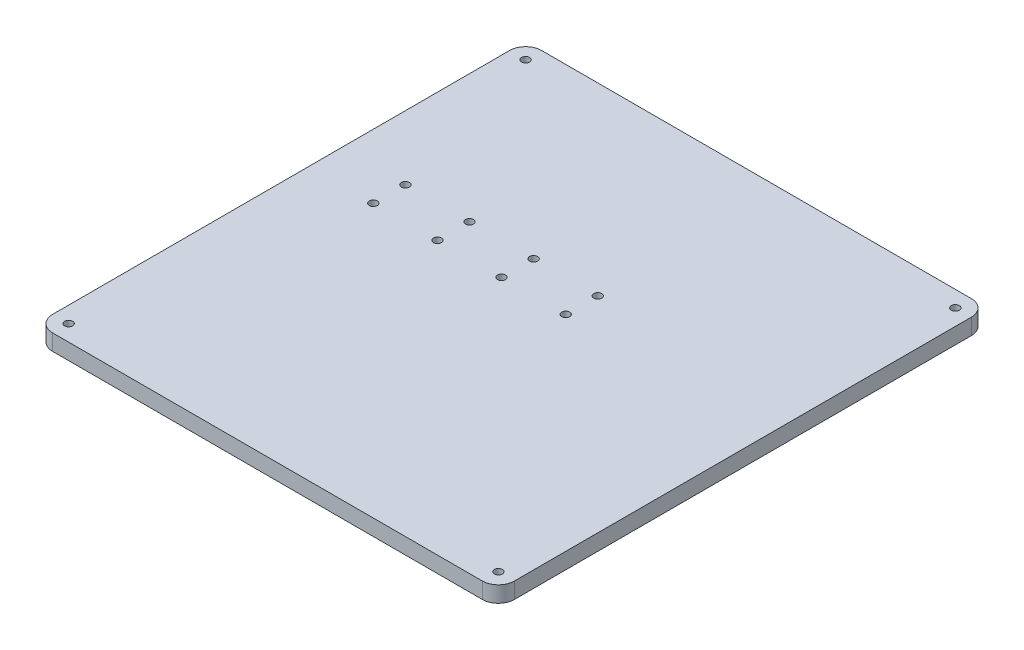
ISO-10303-21;
HEADER;
FILE_DESCRIPTION(('STEP AP214'),'2;1');
FILE_NAME('part.step','',(''),(''),'','','');
FILE_SCHEMA(('AUTOMOTIVE_DESIGN { 1 0 10303 214 1 1 1 1 }'));
ENDSEC;
DATA;
#1=APPLICATION_CONTEXT('core data for automotive mechanical design processes');
#2=APPLICATION_PROTOCOL_DEFINITION('international standard','automotive_design',2000,#1);
#3=PRODUCT_CONTEXT('',#1,'mechanical');
#4=PRODUCT('Part','Part','',(#3));
#5=PRODUCT_RELATED_PRODUCT_CATEGORY('part','',(#4));
#6=PRODUCT_DEFINITION_FORMATION('','',#4);
#7=PRODUCT_DEFINITION_CONTEXT('part definition',#1,'design');
#8=PRODUCT_DEFINITION('design','',#6,#7);
#9=PRODUCT_DEFINITION_SHAPE('','',#8);
#10=(LENGTH_UNIT() NAMED_UNIT(*) SI_UNIT(.MILLI.,.METRE.));
#11=(NAMED_UNIT(*) PLANE_ANGLE_UNIT() SI_UNIT($,.RADIAN.));
#12=(NAMED_UNIT(*) SI_UNIT($,.STERADIAN.) SOLID_ANGLE_UNIT());
#13=UNCERTAINTY_MEASURE_WITH_UNIT(LENGTH_MEASURE(1.E-05),#10,'distance_accuracy_value','');
#14=(GEOMETRIC_REPRESENTATION_CONTEXT(3) GLOBAL_UNCERTAINTY_ASSIGNED_CONTEXT((#13)) GLOBAL_UNIT_ASSIGNED_CONTEXT((#10,
#11,#12)) REPRESENTATION_CONTEXT('',''));
#15=CARTESIAN_POINT('',(0.,0.,0.));
#16=DIRECTION('',(0.,0.,1.));
#17=DIRECTION('',(1.,0.,0.));
#18=AXIS2_PLACEMENT_3D('',#15,#16,#17);
#19=CARTESIAN_POINT('',(0.,10.,0.));
#20=DIRECTION('',(0.,1.,0.));
#21=DIRECTION('',(0.,0.,1.));
#22=AXIS2_PLACEMENT_3D('',#19,#20,#21);
#23=PLANE('',#22);
#24=CARTESIAN_POINT('',(179.382488479263,10.,233.733870967742));
#25=DIRECTION('',(0.,1.,0.));
#26=DIRECTION('',(0.,0.,1.));
#27=AXIS2_PLACEMENT_3D('',#24,#25,#26);
#28=CIRCLE('',#27,2.50000000000002);
#29=CARTESIAN_POINT('',(179.382488479263,10.,236.233870967742));
#30=VERTEX_POINT('',#29);
#31=EDGE_CURVE('E229',#30,#30,#28,.T.);
#32=ORIENTED_EDGE('',*,*,#31,.F.);
#33=EDGE_LOOP('',(#32));
#34=FACE_BOUND('',#33,.T.);
#35=CARTESIAN_POINT('',(-58.6175115207371,10.,73.7338709677419));
#36=DIRECTION('',(0.,1.,0.));
#37=DIRECTION('',(0.,0.,1.));
#38=AXIS2_PLACEMENT_3D('',#35,#36,#37);
#39=CIRCLE('',#38,2.5);
#40=CARTESIAN_POINT('',(-58.6175115207371,10.,76.2338709677419));
#41=VERTEX_POINT('',#40);
#42=EDGE_CURVE('E217',#41,#41,#39,.T.);
#43=ORIENTED_EDGE('',*,*,#42,.F.);
#44=EDGE_LOOP('',(#43));
#45=FACE_BOUND('',#44,.T.);
#46=CARTESIAN_POINT('',(21.3824884792629,10.,73.7338709677419));
#47=DIRECTION('',(0.,1.,0.));
#48=DIRECTION('',(0.,0.,1.));
#49=AXIS2_PLACEMENT_3D('',#46,#47,#48);
#50=CIRCLE('',#49,2.5);
#51=CARTESIAN_POINT('',(21.3824884792629,10.,76.2338709677419));
#52=VERTEX_POINT('',#51);
#53=EDGE_CURVE('E205',#52,#52,#50,.T.);
#54=ORIENTED_EDGE('',*,*,#53,.F.);
#55=EDGE_LOOP('',(#54));
#56=FACE_BOUND('',#55,.T.);
#57=CARTESIAN_POINT('',(61.3824884792627,10.,53.7338709677419));
#58=DIRECTION('',(0.,1.,0.));
#59=DIRECTION('',(0.,0.,1.));
#60=AXIS2_PLACEMENT_3D('',#57,#58,#59);
#61=CIRCLE('',#60,2.49999999999999);
#62=CARTESIAN_POINT('',(61.3824884792627,10.,56.2338709677419));
#63=VERTEX_POINT('',#62);
#64=EDGE_CURVE('E193',#63,#63,#61,.T.);
#65=ORIENTED_EDGE('',*,*,#64,.F.);
#66=EDGE_LOOP('',(#65));
#67=FACE_BOUND('',#66,.T.);
#68=CARTESIAN_POINT('',(-18.6175115207373,10.,53.7338709677419));
#69=DIRECTION('',(0.,1.,0.));
#70=DIRECTION('',(0.,0.,1.));
#71=AXIS2_PLACEMENT_3D('',#68,#69,#70);
#72=CIRCLE('',#71,2.5);
#73=CARTESIAN_POINT('',(-18.6175115207373,10.,56.2338709677419));
#74=VERTEX_POINT('',#73);
#75=EDGE_CURVE('E181',#74,#74,#72,.T.);
#76=ORIENTED_EDGE('',*,*,#75,.F.);
#77=EDGE_LOOP('',(#76));
#78=FACE_BOUND('',#77,.T.);
#79=CARTESIAN_POINT('',(-58.6175115207373,10.,53.7338709677419));
#80=DIRECTION('',(0.,1.,0.));
#81=DIRECTION('',(0.,0.,1.));
#82=AXIS2_PLACEMENT_3D('',#79,#80,#81);
#83=CIRCLE('',#82,2.5);
#84=CARTESIAN_POINT('',(-58.6175115207373,10.,56.2338709677419));
#85=VERTEX_POINT('',#84);
#86=EDGE_CURVE('E164',#85,#85,#83,.T.);
#87=ORIENTED_EDGE('',*,*,#86,.F.);
#88=EDGE_LOOP('',(#87));
#89=FACE_BOUND('',#88,.T.);
#90=DIRECTION('',(0.,0.,-1.));
#91=VECTOR('',#90,1.);
#92=CARTESIAN_POINT('',(189.382488479263,10.,-61.2661290322581));
#93=LINE('',#92,#91);
#94=CARTESIAN_POINT('',(189.382488479263,10.,233.733870967742));
#95=VERTEX_POINT('',#94);
#96=CARTESIAN_POINT('',(189.382488479263,10.,-51.2661290322581));
#97=VERTEX_POINT('',#96);
#98=EDGE_CURVE('E171',#95,#97,#93,.T.);
#99=ORIENTED_EDGE('',*,*,#98,.T.);
#100=CARTESIAN_POINT('',(179.382488479263,10.,-51.2661290322581));
#101=DIRECTION('',(0.,1.,0.));
#102=DIRECTION('',(0.,0.,1.));
#103=AXIS2_PLACEMENT_3D('',#100,#101,#102);
#104=CIRCLE('',#103,10.);
#105=CARTESIAN_POINT('',(179.382488479263,10.,-61.2661290322581));
#106=VERTEX_POINT('',#105);
#107=EDGE_CURVE('E148',#97,#106,#104,.T.);
#108=ORIENTED_EDGE('',*,*,#107,.T.);
#109=DIRECTION('',(-1.,0.,0.));
#110=VECTOR('',#109,1.);
#111=CARTESIAN_POINT('',(-98.6175115207373,10.,-61.2661290322581));
#112=LINE('',#111,#110);
#113=CARTESIAN_POINT('',(-88.6175115207373,10.,-61.2661290322581));
#114=VERTEX_POINT('',#113);
#115=EDGE_CURVE('E119',#106,#114,#112,.T.);
#116=ORIENTED_EDGE('',*,*,#115,.T.);
#117=CARTESIAN_POINT('',(-88.6175115207373,10.,-51.2661290322581));
#118=DIRECTION('',(0.,1.,0.));
#119=DIRECTION('',(0.,0.,1.));
#120=AXIS2_PLACEMENT_3D('',#117,#118,#119);
#121=CIRCLE('',#120,10.);
#122=CARTESIAN_POINT('',(-98.6175115207373,10.,-51.2661290322581));
#123=VERTEX_POINT('',#122);
#124=EDGE_CURVE('E143',#114,#123,#121,.T.);
#125=ORIENTED_EDGE('',*,*,#124,.T.);
#126=DIRECTION('',(0.,0.,1.));
#127=VECTOR('',#126,1.);
#128=CARTESIAN_POINT('',(-98.6175115207373,10.,-61.2661290322581));
#129=LINE('',#128,#127);
#130=CARTESIAN_POINT('',(-98.6175115207373,10.,233.733870967742));
#131=VERTEX_POINT('',#130);
#132=EDGE_CURVE('E126',#123,#131,#129,.T.);
#133=ORIENTED_EDGE('',*,*,#132,.T.);
#134=CARTESIAN_POINT('',(-88.6175115207373,10.,233.733870967742));
#135=DIRECTION('',(0.,1.,0.));
#136=DIRECTION('',(0.,0.,1.));
#137=AXIS2_PLACEMENT_3D('',#134,#135,#136);
#138=CIRCLE('',#137,10.);
#139=CARTESIAN_POINT('',(-88.6175115207373,10.,243.733870967742));
#140=VERTEX_POINT('',#139);
#141=EDGE_CURVE('E55',#131,#140,#138,.T.);
#142=ORIENTED_EDGE('',*,*,#141,.T.);
#143=DIRECTION('',(1.,0.,0.));
#144=VECTOR('',#143,1.);
#145=CARTESIAN_POINT('',(-98.6175115207373,10.,243.733870967742));
#146=LINE('',#145,#144);
#147=CARTESIAN_POINT('',(179.382488479263,10.,243.733870967742));
#148=VERTEX_POINT('',#147);
#149=EDGE_CURVE('E129',#140,#148,#146,.T.);
#150=ORIENTED_EDGE('',*,*,#149,.T.);
#151=CARTESIAN_POINT('',(179.382488479263,10.,233.733870967742));
#152=DIRECTION('',(0.,1.,0.));
#153=DIRECTION('',(0.,0.,1.));
#154=AXIS2_PLACEMENT_3D('',#151,#152,#153);
#155=CIRCLE('',#154,10.);
#156=EDGE_CURVE('E146',#148,#95,#155,.T.);
#157=ORIENTED_EDGE('',*,*,#156,.T.);
#158=EDGE_LOOP('',(#99,#108,#116,#125,#133,#142,#150,#157));
#159=FACE_BOUND('',#158,.T.);
#160=CARTESIAN_POINT('',(-88.6175115207373,10.,-51.2661290322581));
#161=DIRECTION('',(0.,1.,0.));
#162=DIRECTION('',(0.,0.,1.));
#163=AXIS2_PLACEMENT_3D('',#160,#161,#162);
#164=CIRCLE('',#163,2.50000000000001);
#165=CARTESIAN_POINT('',(-88.6175115207373,10.,-48.7661290322581));
#166=VERTEX_POINT('',#165);
#167=EDGE_CURVE('E176',#166,#166,#164,.T.);
#168=ORIENTED_EDGE('',*,*,#167,.F.);
#169=EDGE_LOOP('',(#168));
#170=FACE_BOUND('',#169,.T.);
#171=CARTESIAN_POINT('',(21.3824884792627,10.,53.7338709677419));
#172=DIRECTION('',(0.,1.,0.));
#173=DIRECTION('',(0.,0.,1.));
#174=AXIS2_PLACEMENT_3D('',#171,#172,#173);
#175=CIRCLE('',#174,2.5);
#176=CARTESIAN_POINT('',(21.3824884792627,10.,56.2338709677419));
#177=VERTEX_POINT('',#176);
#178=EDGE_CURVE('E187',#177,#177,#175,.T.);
#179=ORIENTED_EDGE('',*,*,#178,.F.);
#180=EDGE_LOOP('',(#179));
#181=FACE_BOUND('',#180,.T.);
#182=CARTESIAN_POINT('',(-18.6175115207371,10.,73.7338709677419));
#183=DIRECTION('',(0.,1.,0.));
#184=DIRECTION('',(0.,0.,1.));
#185=AXIS2_PLACEMENT_3D('',#182,#183,#184);
#186=CIRCLE('',#185,2.5);
#187=CARTESIAN_POINT('',(-18.6175115207371,10.,76.2338709677419));
#188=VERTEX_POINT('',#187);
#189=EDGE_CURVE('E199',#188,#188,#186,.T.);
#190=ORIENTED_EDGE('',*,*,#189,.F.);
#191=EDGE_LOOP('',(#190));
#192=FACE_BOUND('',#191,.T.);
#193=CARTESIAN_POINT('',(61.3824884792629,10.,73.7338709677419));
#194=DIRECTION('',(0.,1.,0.));
#195=DIRECTION('',(0.,0.,1.));
#196=AXIS2_PLACEMENT_3D('',#193,#194,#195);
#197=CIRCLE('',#196,2.5);
#198=CARTESIAN_POINT('',(61.3824884792629,10.,76.2338709677419));
#199=VERTEX_POINT('',#198);
#200=EDGE_CURVE('E211',#199,#199,#197,.T.);
#201=ORIENTED_EDGE('',*,*,#200,.F.);
#202=EDGE_LOOP('',(#201));
#203=FACE_BOUND('',#202,.T.);
#204=CARTESIAN_POINT('',(179.382488479263,10.,-51.2661290322581));
#205=DIRECTION('',(0.,1.,0.));
#206=DIRECTION('',(0.,0.,-1.));
#207=AXIS2_PLACEMENT_3D('',#204,#205,#206);
#208=CIRCLE('',#207,2.50000000000002);
#209=CARTESIAN_POINT('',(179.382488479263,10.,-53.7661290322581));
#210=VERTEX_POINT('',#209);
#211=EDGE_CURVE('E223',#210,#210,#208,.T.);
#212=ORIENTED_EDGE('',*,*,#211,.F.);
#213=EDGE_LOOP('',(#212));
#214=FACE_BOUND('',#213,.T.);
#215=CARTESIAN_POINT('',(-88.6175115207373,10.,233.733870967742));
#216=DIRECTION('',(0.,1.,0.));
#217=DIRECTION('',(0.,0.,-1.));
#218=AXIS2_PLACEMENT_3D('',#215,#216,#217);
#219=CIRCLE('',#218,2.50000000000001);
#220=CARTESIAN_POINT('',(-88.6175115207373,10.,231.233870967742));
#221=VERTEX_POINT('',#220);
#222=EDGE_CURVE('E235',#221,#221,#219,.T.);
#223=ORIENTED_EDGE('',*,*,#222,.F.);
#224=EDGE_LOOP('',(#223));
#225=FACE_BOUND('',#224,.T.);
#226=ADVANCED_FACE('F33',(#34,#45,#56,#67,#78,#89,#159,#170,#181,#192,#203,#214,#225),#23,.T.);
#227=CARTESIAN_POINT('',(0.,0.,0.));
#228=DIRECTION('',(0.,1.,0.));
#229=DIRECTION('',(0.,0.,1.));
#230=AXIS2_PLACEMENT_3D('',#227,#228,#229);
#231=PLANE('',#230);
#232=DIRECTION('',(-1.,0.,0.));
#233=VECTOR('',#232,1.);
#234=CARTESIAN_POINT('',(-98.6175115207373,0.,-61.2661290322581));
#235=LINE('',#234,#233);
#236=CARTESIAN_POINT('',(179.382488479263,0.,-61.2661290322581));
#237=VERTEX_POINT('',#236);
#238=CARTESIAN_POINT('',(-88.6175115207373,0.,-61.2661290322581));
#239=VERTEX_POINT('',#238);
#240=EDGE_CURVE('E116',#237,#239,#235,.T.);
#241=ORIENTED_EDGE('',*,*,#240,.F.);
#242=CARTESIAN_POINT('',(179.382488479263,0.,-51.2661290322581));
#243=DIRECTION('',(0.,1.,0.));
#244=DIRECTION('',(0.,0.,1.));
#245=AXIS2_PLACEMENT_3D('',#242,#243,#244);
#246=CIRCLE('',#245,10.);
#247=CARTESIAN_POINT('',(189.382488479263,0.,-51.2661290322581));
#248=VERTEX_POINT('',#247);
#249=EDGE_CURVE('E99',#237,#248,#246,.F.);
#250=ORIENTED_EDGE('',*,*,#249,.T.);
#251=DIRECTION('',(0.,0.,-1.));
#252=VECTOR('',#251,1.);
#253=CARTESIAN_POINT('',(189.382488479263,0.,-61.2661290322581));
#254=LINE('',#253,#252);
#255=CARTESIAN_POINT('',(189.382488479263,0.,233.733870967742));
#256=VERTEX_POINT('',#255);
#257=EDGE_CURVE('E127',#256,#248,#254,.T.);
#258=ORIENTED_EDGE('',*,*,#257,.F.);
#259=CARTESIAN_POINT('',(179.382488479263,0.,233.733870967742));
#260=DIRECTION('',(0.,1.,0.));
#261=DIRECTION('',(0.,0.,1.));
#262=AXIS2_PLACEMENT_3D('',#259,#260,#261);
#263=CIRCLE('',#262,10.);
#264=CARTESIAN_POINT('',(179.382488479263,0.,243.733870967742));
#265=VERTEX_POINT('',#264);
#266=EDGE_CURVE('E110',#256,#265,#263,.F.);
#267=ORIENTED_EDGE('',*,*,#266,.T.);
#268=DIRECTION('',(1.,0.,0.));
#269=VECTOR('',#268,1.);
#270=CARTESIAN_POINT('',(-98.6175115207373,0.,243.733870967742));
#271=LINE('',#270,#269);
#272=CARTESIAN_POINT('',(-88.6175115207373,0.,243.733870967742));
#273=VERTEX_POINT('',#272);
#274=EDGE_CURVE('E131',#273,#265,#271,.T.);
#275=ORIENTED_EDGE('',*,*,#274,.F.);
#276=CARTESIAN_POINT('',(-88.6175115207373,0.,233.733870967742));
#277=DIRECTION('',(0.,1.,0.));
#278=DIRECTION('',(0.,0.,1.));
#279=AXIS2_PLACEMENT_3D('',#276,#277,#278);
#280=CIRCLE('',#279,10.);
#281=CARTESIAN_POINT('',(-98.6175115207373,0.,233.733870967742));
#282=VERTEX_POINT('',#281);
#283=EDGE_CURVE('E137',#273,#282,#280,.F.);
#284=ORIENTED_EDGE('',*,*,#283,.T.);
#285=DIRECTION('',(0.,0.,1.));
#286=VECTOR('',#285,1.);
#287=CARTESIAN_POINT('',(-98.6175115207373,0.,-61.2661290322581));
#288=LINE('',#287,#286);
#289=CARTESIAN_POINT('',(-98.6175115207373,0.,-51.2661290322581));
#290=VERTEX_POINT('',#289);
#291=EDGE_CURVE('E159',#290,#282,#288,.T.);
#292=ORIENTED_EDGE('',*,*,#291,.F.);
#293=CARTESIAN_POINT('',(-88.6175115207373,0.,-51.2661290322581));
#294=DIRECTION('',(0.,1.,0.));
#295=DIRECTION('',(0.,0.,1.));
#296=AXIS2_PLACEMENT_3D('',#293,#294,#295);
#297=CIRCLE('',#296,10.);
#298=EDGE_CURVE('E120',#290,#239,#297,.F.);
#299=ORIENTED_EDGE('',*,*,#298,.T.);
#300=EDGE_LOOP('',(#241,#250,#258,#267,#275,#284,#292,#299));
#301=FACE_BOUND('',#300,.T.);
#302=CARTESIAN_POINT('',(-58.6175115207373,0.,53.7338709677419));
#303=DIRECTION('',(0.,1.,0.));
#304=DIRECTION('',(0.,0.,1.));
#305=AXIS2_PLACEMENT_3D('',#302,#303,#304);
#306=CIRCLE('',#305,2.5);
#307=CARTESIAN_POINT('',(-58.6175115207373,0.,56.2338709677419));
#308=VERTEX_POINT('',#307);
#309=EDGE_CURVE('E167',#308,#308,#306,.T.);
#310=ORIENTED_EDGE('',*,*,#309,.T.);
#311=EDGE_LOOP('',(#310));
#312=FACE_BOUND('',#311,.T.);
#313=CARTESIAN_POINT('',(-88.6175115207373,0.,-51.2661290322581));
#314=DIRECTION('',(0.,1.,0.));
#315=DIRECTION('',(0.,0.,1.));
#316=AXIS2_PLACEMENT_3D('',#313,#314,#315);
#317=CIRCLE('',#316,2.50000000000001);
#318=CARTESIAN_POINT('',(-88.6175115207373,0.,-48.7661290322581));
#319=VERTEX_POINT('',#318);
#320=EDGE_CURVE('E178',#319,#319,#317,.T.);
#321=ORIENTED_EDGE('',*,*,#320,.T.);
#322=EDGE_LOOP('',(#321));
#323=FACE_BOUND('',#322,.T.);
#324=CARTESIAN_POINT('',(-18.6175115207373,0.,53.7338709677419));
#325=DIRECTION('',(0.,1.,0.));
#326=DIRECTION('',(0.,0.,1.));
#327=AXIS2_PLACEMENT_3D('',#324,#325,#326);
#328=CIRCLE('',#327,2.5);
#329=CARTESIAN_POINT('',(-18.6175115207373,0.,56.2338709677419));
#330=VERTEX_POINT('',#329);
#331=EDGE_CURVE('E184',#330,#330,#328,.T.);
#332=ORIENTED_EDGE('',*,*,#331,.T.);
#333=EDGE_LOOP('',(#332));
#334=FACE_BOUND('',#333,.T.);
#335=CARTESIAN_POINT('',(21.3824884792627,0.,53.7338709677419));
#336=DIRECTION('',(0.,1.,0.));
#337=DIRECTION('',(0.,0.,1.));
#338=AXIS2_PLACEMENT_3D('',#335,#336,#337);
#339=CIRCLE('',#338,2.5);
#340=CARTESIAN_POINT('',(21.3824884792627,0.,56.2338709677419));
#341=VERTEX_POINT('',#340);
#342=EDGE_CURVE('E190',#341,#341,#339,.T.);
#343=ORIENTED_EDGE('',*,*,#342,.T.);
#344=EDGE_LOOP('',(#343));
#345=FACE_BOUND('',#344,.T.);
#346=CARTESIAN_POINT('',(61.3824884792627,0.,53.7338709677419));
#347=DIRECTION('',(0.,1.,0.));
#348=DIRECTION('',(0.,0.,1.));
#349=AXIS2_PLACEMENT_3D('',#346,#347,#348);
#350=CIRCLE('',#349,2.49999999999999);
#351=CARTESIAN_POINT('',(61.3824884792627,0.,56.2338709677419));
#352=VERTEX_POINT('',#351);
#353=EDGE_CURVE('E196',#352,#352,#350,.T.);
#354=ORIENTED_EDGE('',*,*,#353,.T.);
#355=EDGE_LOOP('',(#354));
#356=FACE_BOUND('',#355,.T.);
#357=CARTESIAN_POINT('',(-18.6175115207371,0.,73.7338709677419));
#358=DIRECTION('',(0.,1.,0.));
#359=DIRECTION('',(0.,0.,1.));
#360=AXIS2_PLACEMENT_3D('',#357,#358,#359);
#361=CIRCLE('',#360,2.5);
#362=CARTESIAN_POINT('',(-18.6175115207371,0.,76.2338709677419));
#363=VERTEX_POINT('',#362);
#364=EDGE_CURVE('E202',#363,#363,#361,.T.);
#365=ORIENTED_EDGE('',*,*,#364,.T.);
#366=EDGE_LOOP('',(#365));
#367=FACE_BOUND('',#366,.T.);
#368=CARTESIAN_POINT('',(21.3824884792629,0.,73.7338709677419));
#369=DIRECTION('',(0.,1.,0.));
#370=DIRECTION('',(0.,0.,1.));
#371=AXIS2_PLACEMENT_3D('',#368,#369,#370);
#372=CIRCLE('',#371,2.5);
#373=CARTESIAN_POINT('',(21.3824884792629,0.,76.2338709677419));
#374=VERTEX_POINT('',#373);
#375=EDGE_CURVE('E208',#374,#374,#372,.T.);
#376=ORIENTED_EDGE('',*,*,#375,.T.);
#377=EDGE_LOOP('',(#376));
#378=FACE_BOUND('',#377,.T.);
#379=CARTESIAN_POINT('',(61.3824884792629,0.,73.7338709677419));
#380=DIRECTION('',(0.,1.,0.));
#381=DIRECTION('',(0.,0.,1.));
#382=AXIS2_PLACEMENT_3D('',#379,#380,#381);
#383=CIRCLE('',#382,2.5);
#384=CARTESIAN_POINT('',(61.3824884792629,0.,76.2338709677419));
#385=VERTEX_POINT('',#384);
#386=EDGE_CURVE('E214',#385,#385,#383,.T.);
#387=ORIENTED_EDGE('',*,*,#386,.T.);
#388=EDGE_LOOP('',(#387));
#389=FACE_BOUND('',#388,.T.);
#390=CARTESIAN_POINT('',(-58.6175115207371,0.,73.7338709677419));
#391=DIRECTION('',(0.,1.,0.));
#392=DIRECTION('',(0.,0.,1.));
#393=AXIS2_PLACEMENT_3D('',#390,#391,#392);
#394=CIRCLE('',#393,2.5);
#395=CARTESIAN_POINT('',(-58.6175115207371,0.,76.2338709677419));
#396=VERTEX_POINT('',#395);
#397=EDGE_CURVE('E220',#396,#396,#394,.T.);
#398=ORIENTED_EDGE('',*,*,#397,.T.);
#399=EDGE_LOOP('',(#398));
#400=FACE_BOUND('',#399,.T.);
#401=CARTESIAN_POINT('',(179.382488479263,0.,-51.2661290322581));
#402=DIRECTION('',(0.,1.,0.));
#403=DIRECTION('',(0.,0.,-1.));
#404=AXIS2_PLACEMENT_3D('',#401,#402,#403);
#405=CIRCLE('',#404,2.50000000000002);
#406=CARTESIAN_POINT('',(179.382488479263,0.,-53.7661290322581));
#407=VERTEX_POINT('',#406);
#408=EDGE_CURVE('E226',#407,#407,#405,.T.);
#409=ORIENTED_EDGE('',*,*,#408,.T.);
#410=EDGE_LOOP('',(#409));
#411=FACE_BOUND('',#410,.T.);
#412=CARTESIAN_POINT('',(179.382488479263,0.,233.733870967742));
#413=DIRECTION('',(0.,1.,0.));
#414=DIRECTION('',(0.,0.,1.));
#415=AXIS2_PLACEMENT_3D('',#412,#413,#414);
#416=CIRCLE('',#415,2.50000000000002);
#417=CARTESIAN_POINT('',(179.382488479263,0.,236.233870967742));
#418=VERTEX_POINT('',#417);
#419=EDGE_CURVE('E232',#418,#418,#416,.T.);
#420=ORIENTED_EDGE('',*,*,#419,.T.);
#421=EDGE_LOOP('',(#420));
#422=FACE_BOUND('',#421,.T.);
#423=CARTESIAN_POINT('',(-88.6175115207373,0.,233.733870967742));
#424=DIRECTION('',(0.,1.,0.));
#425=DIRECTION('',(0.,0.,-1.));
#426=AXIS2_PLACEMENT_3D('',#423,#424,#425);
#427=CIRCLE('',#426,2.50000000000001);
#428=CARTESIAN_POINT('',(-88.6175115207373,0.,231.233870967742));
#429=VERTEX_POINT('',#428);
#430=EDGE_CURVE('E238',#429,#429,#427,.T.);
#431=ORIENTED_EDGE('',*,*,#430,.T.);
#432=EDGE_LOOP('',(#431));
#433=FACE_BOUND('',#432,.T.);
#434=ADVANCED_FACE('F123',(#301,#312,#323,#334,#345,#356,#367,#378,#389,#400,#411,#422,#433),
#231,.F.);
#435=CARTESIAN_POINT('',(-98.6175115207373,10.,-61.2661290322581));
#436=DIRECTION('',(1.,0.,0.));
#437=DIRECTION('',(0.,0.,-1.));
#438=AXIS2_PLACEMENT_3D('',#435,#436,#437);
#439=PLANE('',#438);
#440=ORIENTED_EDGE('',*,*,#291,.T.);
#441=DIRECTION('',(0.,-1.,0.));
#442=VECTOR('',#441,1.);
#443=CARTESIAN_POINT('',(-98.6175115207373,10.,233.733870967742));
#444=LINE('',#443,#442);
#445=EDGE_CURVE('E11',#282,#131,#444,.F.);
#446=ORIENTED_EDGE('',*,*,#445,.T.);
#447=ORIENTED_EDGE('',*,*,#132,.F.);
#448=DIRECTION('',(0.,-1.,0.));
#449=VECTOR('',#448,1.);
#450=CARTESIAN_POINT('',(-98.6175115207373,10.,-51.2661290322581));
#451=LINE('',#450,#449);
#452=EDGE_CURVE('E41',#123,#290,#451,.T.);
#453=ORIENTED_EDGE('',*,*,#452,.T.);
#454=EDGE_LOOP('',(#440,#446,#447,#453));
#455=FACE_BOUND('',#454,.T.);
#456=ADVANCED_FACE('F158',(#455),#439,.F.);
#457=CARTESIAN_POINT('',(-98.6175115207373,10.,243.733870967742));
#458=DIRECTION('',(0.,0.,-1.));
#459=DIRECTION('',(-1.,0.,0.));
#460=AXIS2_PLACEMENT_3D('',#457,#458,#459);
#461=PLANE('',#460);
#462=ORIENTED_EDGE('',*,*,#274,.T.);
#463=DIRECTION('',(0.,-1.,0.));
#464=VECTOR('',#463,1.);
#465=CARTESIAN_POINT('',(179.382488479263,10.,243.733870967742));
#466=LINE('',#465,#464);
#467=EDGE_CURVE('E48',#265,#148,#466,.F.);
#468=ORIENTED_EDGE('',*,*,#467,.T.);
#469=ORIENTED_EDGE('',*,*,#149,.F.);
#470=DIRECTION('',(0.,-1.,0.));
#471=VECTOR('',#470,1.);
#472=CARTESIAN_POINT('',(-88.6175115207373,10.,243.733870967742));
#473=LINE('',#472,#471);
#474=EDGE_CURVE('E150',#140,#273,#473,.T.);
#475=ORIENTED_EDGE('',*,*,#474,.T.);
#476=EDGE_LOOP('',(#462,#468,#469,#475));
#477=FACE_BOUND('',#476,.T.);
#478=ADVANCED_FACE('F266',(#477),#461,.F.);
#479=CARTESIAN_POINT('',(189.382488479263,10.,-61.2661290322581));
#480=DIRECTION('',(-1.,0.,0.));
#481=DIRECTION('',(0.,0.,1.));
#482=AXIS2_PLACEMENT_3D('',#479,#480,#481);
#483=PLANE('',#482);
#484=ORIENTED_EDGE('',*,*,#257,.T.);
#485=DIRECTION('',(0.,-1.,0.));
#486=VECTOR('',#485,1.);
#487=CARTESIAN_POINT('',(189.382488479263,10.,-51.2661290322581));
#488=LINE('',#487,#486);
#489=EDGE_CURVE('E104',#248,#97,#488,.F.);
#490=ORIENTED_EDGE('',*,*,#489,.T.);
#491=ORIENTED_EDGE('',*,*,#98,.F.);
#492=DIRECTION('',(0.,-1.,0.));
#493=VECTOR('',#492,1.);
#494=CARTESIAN_POINT('',(189.382488479263,10.,233.733870967742));
#495=LINE('',#494,#493);
#496=EDGE_CURVE('E109',#95,#256,#495,.T.);
#497=ORIENTED_EDGE('',*,*,#496,.T.);
#498=EDGE_LOOP('',(#484,#490,#491,#497));
#499=FACE_BOUND('',#498,.T.);
#500=ADVANCED_FACE('F263',(#499),#483,.F.);
#501=CARTESIAN_POINT('',(-98.6175115207373,10.,-61.2661290322581));
#502=DIRECTION('',(0.,0.,1.));
#503=DIRECTION('',(1.,0.,0.));
#504=AXIS2_PLACEMENT_3D('',#501,#502,#503);
#505=PLANE('',#504);
#506=ORIENTED_EDGE('',*,*,#115,.F.);
#507=DIRECTION('',(0.,-1.,0.));
#508=VECTOR('',#507,1.);
#509=CARTESIAN_POINT('',(179.382488479263,10.,-61.2661290322581));
#510=LINE('',#509,#508);
#511=EDGE_CURVE('E103',#106,#237,#510,.T.);
#512=ORIENTED_EDGE('',*,*,#511,.T.);
#513=ORIENTED_EDGE('',*,*,#240,.T.);
#514=DIRECTION('',(0.,-1.,0.));
#515=VECTOR('',#514,1.);
#516=CARTESIAN_POINT('',(-88.6175115207373,10.,-61.2661290322581));
#517=LINE('',#516,#515);
#518=EDGE_CURVE('E121',#239,#114,#517,.F.);
#519=ORIENTED_EDGE('',*,*,#518,.T.);
#520=EDGE_LOOP('',(#506,#512,#513,#519));
#521=FACE_BOUND('',#520,.T.);
#522=ADVANCED_FACE('F115',(#521),#505,.F.);
#523=CARTESIAN_POINT('',(-58.6175115207373,10.,53.7338709677419));
#524=DIRECTION('',(0.,-1.,0.));
#525=DIRECTION('',(0.,0.,-1.));
#526=AXIS2_PLACEMENT_3D('',#523,#524,#525);
#527=CYLINDRICAL_SURFACE('',#526,2.5);
#528=ORIENTED_EDGE('',*,*,#86,.T.);
#529=EDGE_LOOP('',(#528));
#530=FACE_BOUND('',#529,.T.);
#531=ORIENTED_EDGE('',*,*,#309,.F.);
#532=EDGE_LOOP('',(#531));
#533=FACE_BOUND('',#532,.T.);
#534=ADVANCED_FACE('F258',(#530,#533),#527,.F.);
#535=CARTESIAN_POINT('',(-88.6175115207373,10.,-51.2661290322581));
#536=DIRECTION('',(0.,-1.,0.));
#537=DIRECTION('',(0.,0.,-1.));
#538=AXIS2_PLACEMENT_3D('',#535,#536,#537);
#539=CYLINDRICAL_SURFACE('',#538,2.50000000000001);
#540=ORIENTED_EDGE('',*,*,#167,.T.);
#541=EDGE_LOOP('',(#540));
#542=FACE_BOUND('',#541,.T.);
#543=ORIENTED_EDGE('',*,*,#320,.F.);
#544=EDGE_LOOP('',(#543));
#545=FACE_BOUND('',#544,.T.);
#546=ADVANCED_FACE('F342',(#542,#545),#539,.F.);
#547=CARTESIAN_POINT('',(-18.6175115207373,10.,53.7338709677419));
#548=DIRECTION('',(0.,-1.,0.));
#549=DIRECTION('',(0.,0.,-1.));
#550=AXIS2_PLACEMENT_3D('',#547,#548,#549);
#551=CYLINDRICAL_SURFACE('',#550,2.5);
#552=ORIENTED_EDGE('',*,*,#75,.T.);
#553=EDGE_LOOP('',(#552));
#554=FACE_BOUND('',#553,.T.);
#555=ORIENTED_EDGE('',*,*,#331,.F.);
#556=EDGE_LOOP('',(#555));
#557=FACE_BOUND('',#556,.T.);
#558=ADVANCED_FACE('F339',(#554,#557),#551,.F.);
#559=CARTESIAN_POINT('',(21.3824884792627,10.,53.7338709677419));
#560=DIRECTION('',(0.,-1.,0.));
#561=DIRECTION('',(0.,0.,-1.));
#562=AXIS2_PLACEMENT_3D('',#559,#560,#561);
#563=CYLINDRICAL_SURFACE('',#562,2.5);
#564=ORIENTED_EDGE('',*,*,#178,.T.);
#565=EDGE_LOOP('',(#564));
#566=FACE_BOUND('',#565,.T.);
#567=ORIENTED_EDGE('',*,*,#342,.F.);
#568=EDGE_LOOP('',(#567));
#569=FACE_BOUND('',#568,.T.);
#570=ADVANCED_FACE('F335',(#566,#569),#563,.F.);
#571=CARTESIAN_POINT('',(61.3824884792627,10.,53.7338709677419));
#572=DIRECTION('',(0.,-1.,0.));
#573=DIRECTION('',(0.,0.,-1.));
#574=AXIS2_PLACEMENT_3D('',#571,#572,#573);
#575=CYLINDRICAL_SURFACE('',#574,2.49999999999999);
#576=ORIENTED_EDGE('',*,*,#64,.T.);
#577=EDGE_LOOP('',(#576));
#578=FACE_BOUND('',#577,.T.);
#579=ORIENTED_EDGE('',*,*,#353,.F.);
#580=EDGE_LOOP('',(#579));
#581=FACE_BOUND('',#580,.T.);
#582=ADVANCED_FACE('F331',(#578,#581),#575,.F.);
#583=CARTESIAN_POINT('',(-18.6175115207371,10.,73.7338709677419));
#584=DIRECTION('',(0.,-1.,0.));
#585=DIRECTION('',(0.,0.,-1.));
#586=AXIS2_PLACEMENT_3D('',#583,#584,#585);
#587=CYLINDRICAL_SURFACE('',#586,2.5);
#588=ORIENTED_EDGE('',*,*,#189,.T.);
#589=EDGE_LOOP('',(#588));
#590=FACE_BOUND('',#589,.T.);
#591=ORIENTED_EDGE('',*,*,#364,.F.);
#592=EDGE_LOOP('',(#591));
#593=FACE_BOUND('',#592,.T.);
#594=ADVANCED_FACE('F327',(#590,#593),#587,.F.);
#595=CARTESIAN_POINT('',(21.3824884792629,10.,73.7338709677419));
#596=DIRECTION('',(0.,-1.,0.));
#597=DIRECTION('',(0.,0.,-1.));
#598=AXIS2_PLACEMENT_3D('',#595,#596,#597);
#599=CYLINDRICAL_SURFACE('',#598,2.5);
#600=ORIENTED_EDGE('',*,*,#53,.T.);
#601=EDGE_LOOP('',(#600));
#602=FACE_BOUND('',#601,.T.);
#603=ORIENTED_EDGE('',*,*,#375,.F.);
#604=EDGE_LOOP('',(#603));
#605=FACE_BOUND('',#604,.T.);
#606=ADVANCED_FACE('F323',(#602,#605),#599,.F.);
#607=CARTESIAN_POINT('',(61.3824884792629,10.,73.7338709677419));
#608=DIRECTION('',(0.,-1.,0.));
#609=DIRECTION('',(0.,0.,-1.));
#610=AXIS2_PLACEMENT_3D('',#607,#608,#609);
#611=CYLINDRICAL_SURFACE('',#610,2.5);
#612=ORIENTED_EDGE('',*,*,#200,.T.);
#613=EDGE_LOOP('',(#612));
#614=FACE_BOUND('',#613,.T.);
#615=ORIENTED_EDGE('',*,*,#386,.F.);
#616=EDGE_LOOP('',(#615));
#617=FACE_BOUND('',#616,.T.);
#618=ADVANCED_FACE('F319',(#614,#617),#611,.F.);
#619=CARTESIAN_POINT('',(-58.6175115207371,10.,73.7338709677419));
#620=DIRECTION('',(0.,-1.,0.));
#621=DIRECTION('',(0.,0.,-1.));
#622=AXIS2_PLACEMENT_3D('',#619,#620,#621);
#623=CYLINDRICAL_SURFACE('',#622,2.5);
#624=ORIENTED_EDGE('',*,*,#42,.T.);
#625=EDGE_LOOP('',(#624));
#626=FACE_BOUND('',#625,.T.);
#627=ORIENTED_EDGE('',*,*,#397,.F.);
#628=EDGE_LOOP('',(#627));
#629=FACE_BOUND('',#628,.T.);
#630=ADVANCED_FACE('F302',(#626,#629),#623,.F.);
#631=CARTESIAN_POINT('',(179.382488479263,10.,-51.2661290322581));
#632=DIRECTION('',(0.,-1.,0.));
#633=DIRECTION('',(0.,0.,-1.));
#634=AXIS2_PLACEMENT_3D('',#631,#632,#633);
#635=CYLINDRICAL_SURFACE('',#634,2.50000000000002);
#636=ORIENTED_EDGE('',*,*,#211,.T.);
#637=EDGE_LOOP('',(#636));
#638=FACE_BOUND('',#637,.T.);
#639=ORIENTED_EDGE('',*,*,#408,.F.);
#640=EDGE_LOOP('',(#639));
#641=FACE_BOUND('',#640,.T.);
#642=ADVANCED_FACE('F298',(#638,#641),#635,.F.);
#643=CARTESIAN_POINT('',(179.382488479263,10.,233.733870967742));
#644=DIRECTION('',(0.,-1.,0.));
#645=DIRECTION('',(0.,0.,-1.));
#646=AXIS2_PLACEMENT_3D('',#643,#644,#645);
#647=CYLINDRICAL_SURFACE('',#646,2.50000000000002);
#648=ORIENTED_EDGE('',*,*,#31,.T.);
#649=EDGE_LOOP('',(#648));
#650=FACE_BOUND('',#649,.T.);
#651=ORIENTED_EDGE('',*,*,#419,.F.);
#652=EDGE_LOOP('',(#651));
#653=FACE_BOUND('',#652,.T.);
#654=ADVANCED_FACE('F301',(#650,#653),#647,.F.);
#655=CARTESIAN_POINT('',(-88.6175115207373,10.,233.733870967742));
#656=DIRECTION('',(0.,-1.,0.));
#657=DIRECTION('',(0.,0.,-1.));
#658=AXIS2_PLACEMENT_3D('',#655,#656,#657);
#659=CYLINDRICAL_SURFACE('',#658,2.50000000000001);
#660=ORIENTED_EDGE('',*,*,#222,.T.);
#661=EDGE_LOOP('',(#660));
#662=FACE_BOUND('',#661,.T.);
#663=ORIENTED_EDGE('',*,*,#430,.F.);
#664=EDGE_LOOP('',(#663));
#665=FACE_BOUND('',#664,.T.);
#666=ADVANCED_FACE('F244',(#662,#665),#659,.F.);
#667=CARTESIAN_POINT('',(179.382488479263,10.,-51.2661290322581));
#668=DIRECTION('',(0.,-1.,0.));
#669=DIRECTION('',(0.,0.,-1.));
#670=AXIS2_PLACEMENT_3D('',#667,#668,#669);
#671=CYLINDRICAL_SURFACE('',#670,10.);
#672=ORIENTED_EDGE('',*,*,#107,.F.);
#673=ORIENTED_EDGE('',*,*,#489,.F.);
#674=ORIENTED_EDGE('',*,*,#249,.F.);
#675=ORIENTED_EDGE('',*,*,#511,.F.);
#676=EDGE_LOOP('',(#672,#673,#674,#675));
#677=FACE_BOUND('',#676,.T.);
#678=ADVANCED_FACE('F102',(#677),#671,.T.);
#679=CARTESIAN_POINT('',(179.382488479263,10.,233.733870967742));
#680=DIRECTION('',(0.,-1.,0.));
#681=DIRECTION('',(0.,0.,-1.));
#682=AXIS2_PLACEMENT_3D('',#679,#680,#681);
#683=CYLINDRICAL_SURFACE('',#682,10.);
#684=ORIENTED_EDGE('',*,*,#156,.F.);
#685=ORIENTED_EDGE('',*,*,#467,.F.);
#686=ORIENTED_EDGE('',*,*,#266,.F.);
#687=ORIENTED_EDGE('',*,*,#496,.F.);
#688=EDGE_LOOP('',(#684,#685,#686,#687));
#689=FACE_BOUND('',#688,.T.);
#690=ADVANCED_FACE('F274',(#689),#683,.T.);
#691=CARTESIAN_POINT('',(-88.6175115207373,10.,233.733870967742));
#692=DIRECTION('',(0.,-1.,0.));
#693=DIRECTION('',(0.,0.,-1.));
#694=AXIS2_PLACEMENT_3D('',#691,#692,#693);
#695=CYLINDRICAL_SURFACE('',#694,10.);
#696=ORIENTED_EDGE('',*,*,#141,.F.);
#697=ORIENTED_EDGE('',*,*,#445,.F.);
#698=ORIENTED_EDGE('',*,*,#283,.F.);
#699=ORIENTED_EDGE('',*,*,#474,.F.);
#700=EDGE_LOOP('',(#696,#697,#698,#699));
#701=FACE_BOUND('',#700,.T.);
#702=ADVANCED_FACE('F276',(#701),#695,.T.);
#703=CARTESIAN_POINT('',(-88.6175115207373,10.,-51.2661290322581));
#704=DIRECTION('',(0.,-1.,0.));
#705=DIRECTION('',(0.,0.,-1.));
#706=AXIS2_PLACEMENT_3D('',#703,#704,#705);
#707=CYLINDRICAL_SURFACE('',#706,10.);
#708=ORIENTED_EDGE('',*,*,#124,.F.);
#709=ORIENTED_EDGE('',*,*,#518,.F.);
#710=ORIENTED_EDGE('',*,*,#298,.F.);
#711=ORIENTED_EDGE('',*,*,#452,.F.);
#712=EDGE_LOOP('',(#708,#709,#710,#711));
#713=FACE_BOUND('',#712,.T.);
#714=ADVANCED_FACE('F35',(#713),#707,.T.);
#715=CLOSED_SHELL('',(#226,#434,#456,#478,#500,#522,#534,#546,#558,#570,#582,#594,#606,#618,
#630,#642,#654,#666,#678,#690,#702,#714));
#716=MANIFOLD_SOLID_BREP('B2',#715);
#717=ADVANCED_BREP_SHAPE_REPRESENTATION('',(#18,#716),#14);
#718=SHAPE_DEFINITION_REPRESENTATION(#9,#717);
ENDSEC;
END-ISO-10303-21;
